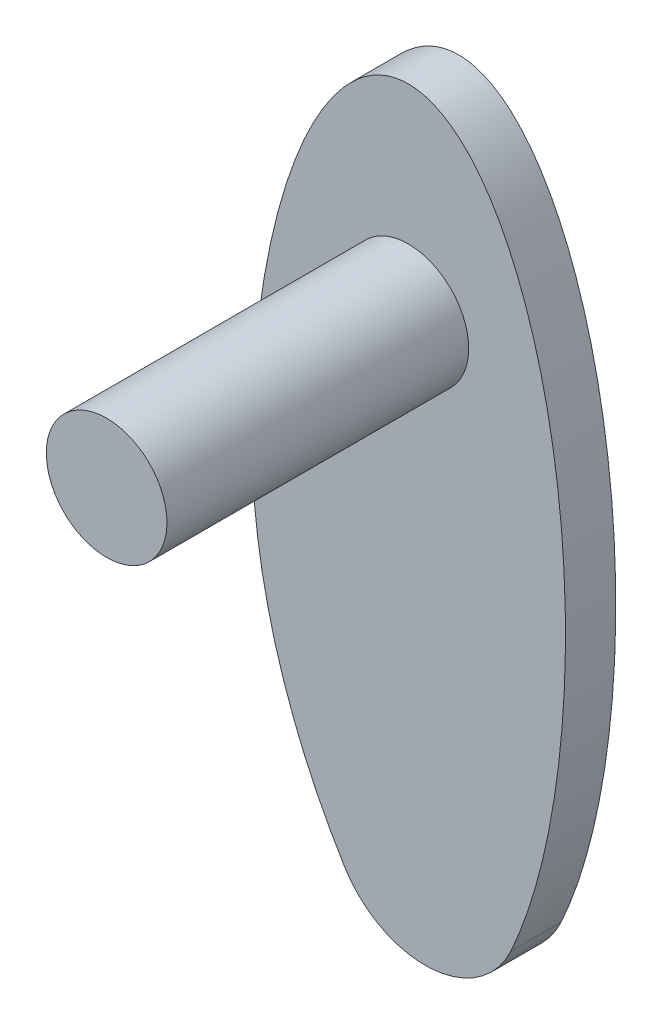
ISO-10303-21;
HEADER;
FILE_DESCRIPTION(('STEP AP214'),'2;1');
FILE_NAME('part.step','',(''),(''),'','','');
FILE_SCHEMA(('AUTOMOTIVE_DESIGN { 1 0 10303 214 1 1 1 1 }'));
ENDSEC;
DATA;
#1=APPLICATION_CONTEXT('core data for automotive mechanical design processes');
#2=APPLICATION_PROTOCOL_DEFINITION('international standard','automotive_design',2000,#1);
#3=PRODUCT_CONTEXT('',#1,'mechanical');
#4=PRODUCT('Part','Part','',(#3));
#5=PRODUCT_RELATED_PRODUCT_CATEGORY('part','',(#4));
#6=PRODUCT_DEFINITION_FORMATION('','',#4);
#7=PRODUCT_DEFINITION_CONTEXT('part definition',#1,'design');
#8=PRODUCT_DEFINITION('design','',#6,#7);
#9=PRODUCT_DEFINITION_SHAPE('','',#8);
#10=(LENGTH_UNIT() NAMED_UNIT(*) SI_UNIT(.MILLI.,.METRE.));
#11=(NAMED_UNIT(*) PLANE_ANGLE_UNIT() SI_UNIT($,.RADIAN.));
#12=(NAMED_UNIT(*) SI_UNIT($,.STERADIAN.) SOLID_ANGLE_UNIT());
#13=UNCERTAINTY_MEASURE_WITH_UNIT(LENGTH_MEASURE(1.E-05),#10,'distance_accuracy_value','');
#14=(GEOMETRIC_REPRESENTATION_CONTEXT(3) GLOBAL_UNCERTAINTY_ASSIGNED_CONTEXT((#13)) GLOBAL_UNIT_ASSIGNED_CONTEXT((#10,
#11,#12)) REPRESENTATION_CONTEXT('',''));
#15=CARTESIAN_POINT('',(0.,0.,0.));
#16=DIRECTION('',(0.,0.,1.));
#17=DIRECTION('',(1.,0.,0.));
#18=AXIS2_PLACEMENT_3D('',#15,#16,#17);
#19=CARTESIAN_POINT('',(-2.55588075372051,-17.4212312040918,2.));
#20=CARTESIAN_POINT('',(9.94411924627949,-17.4212312040918,2.));
#21=CARTESIAN_POINT('',(9.94411924627949,14.2454354625749,2.));
#22=CARTESIAN_POINT('',(-2.55588075372051,14.2454354625749,2.));
#23=CARTESIAN_POINT('',(-15.0558807537205,14.2454354625749,2.));
#24=CARTESIAN_POINT('',(-15.0558807537205,-17.4212312040918,2.));
#25=CARTESIAN_POINT('',(-2.55588075372051,-17.4212312040918,2.));
#26=(BOUNDED_CURVE() B_SPLINE_CURVE(3,(#19,#20,#21,#22,#23,#24,#25),.UNSPECIFIED.,.T.,
.F.) B_SPLINE_CURVE_WITH_KNOTS((4,3,4),(0.,0.5,1.),
.UNSPECIFIED.) CURVE() GEOMETRIC_REPRESENTATION_ITEM() RATIONAL_B_SPLINE_CURVE((1.,
0.333333333333333,0.333333333333333,1.,0.333333333333333,0.333333333333333,1.)) REPRESENTATION_ITEM(''));
#27=DIRECTION('',(0.,0.,-1.));
#28=VECTOR('',#27,1.);
#29=SURFACE_OF_LINEAR_EXTRUSION('',#26,#28);
#30=CARTESIAN_POINT('',(1.5156159873441,-13.6006574199439,2.));
#31=CARTESIAN_POINT('',(5.19639643160717,-5.59428302332968,2.));
#32=CARTESIAN_POINT('',(4.66204025063316,6.62121953506946,2.));
#33=CARTESIAN_POINT('',(0.378602795937045,12.3917200299613,2.));
#34=CARTESIAN_POINT('',(-3.90483465875907,18.1622205248531,2.));
#35=CARTESIAN_POINT('',(-8.20142027791291,12.4547975971881,2.));
#36=CARTESIAN_POINT('',(-8.76375337197133,0.24735754525041,2.));
#37=(BOUNDED_CURVE() B_SPLINE_CURVE(3,(#30,#31,#32,#33,#34,#35,#36),.UNSPECIFIED.,.F.,
.F.) B_SPLINE_CURVE_WITH_KNOTS((4,3,4),(0.,0.5,1.),
.UNSPECIFIED.) CURVE() GEOMETRIC_REPRESENTATION_ITEM() RATIONAL_B_SPLINE_CURVE((1.,
0.709272973028667,0.709272973028667,1.,0.709272973028667,0.709272973028667,1.)) REPRESENTATION_ITEM(''));
#38=CARTESIAN_POINT('',(1.5156159873441,-13.6006574199439,2.));
#39=VERTEX_POINT('',#38);
#40=CARTESIAN_POINT('',(-8.76375337199327,0.247357545256898,2.));
#41=VERTEX_POINT('',#40);
#42=EDGE_CURVE('E73',#39,#41,#37,.T.);
#43=ORIENTED_EDGE('',*,*,#42,.F.);
#44=DIRECTION('',(0.,0.,-1.));
#45=VECTOR('',#44,1.);
#46=CARTESIAN_POINT('',(1.5156159897436,-13.600657421047,2.));
#47=LINE('',#46,#45);
#48=CARTESIAN_POINT('',(1.5156159897436,-13.600657421047,0.));
#49=VERTEX_POINT('',#48);
#50=EDGE_CURVE('E81',#39,#49,#47,.T.);
#51=ORIENTED_EDGE('',*,*,#50,.T.);
#52=CARTESIAN_POINT('',(1.5156159897436,-13.600657421047,0.));
#53=CARTESIAN_POINT('',(5.19639643209695,-5.59428301617578,0.));
#54=CARTESIAN_POINT('',(4.66204024900677,6.62121954701542,0.));
#55=CARTESIAN_POINT('',(0.378602793782711,12.3917200402212,0.));
#56=CARTESIAN_POINT('',(-3.90483466144135,18.162220533427,0.));
#57=CARTESIAN_POINT('',(-8.20142027948347,12.4547975996194,0.));
#58=CARTESIAN_POINT('',(-8.76375337217039,0.247357541895043,0.));
#59=(BOUNDED_CURVE() B_SPLINE_CURVE(3,(#52,#53,#54,#55,#56,#57,#58),.UNSPECIFIED.,.F.,
.F.) B_SPLINE_CURVE_WITH_KNOTS((4,3,4),(0.,0.5,1.),
.UNSPECIFIED.) CURVE() GEOMETRIC_REPRESENTATION_ITEM() RATIONAL_B_SPLINE_CURVE((1.,
0.709272973060496,0.709272973060496,1.,0.709272973060495,0.709272973060495,1.)) REPRESENTATION_ITEM(''));
#60=CARTESIAN_POINT('',(-8.76375337217039,0.247357541895043,0.));
#61=VERTEX_POINT('',#60);
#62=EDGE_CURVE('E87',#49,#61,#59,.T.);
#63=ORIENTED_EDGE('',*,*,#62,.T.);
#64=DIRECTION('',(0.,0.,-1.));
#65=VECTOR('',#64,1.);
#66=CARTESIAN_POINT('',(-8.76375337217039,0.247357541895039,0.));
#67=LINE('',#66,#65);
#68=EDGE_CURVE('E106',#61,#41,#67,.F.);
#69=ORIENTED_EDGE('',*,*,#68,.T.);
#70=EDGE_LOOP('',(#43,#51,#63,#69));
#71=FACE_BOUND('',#70,.T.);
#72=ADVANCED_FACE('F39',(#71),#29,.F.);
#73=CARTESIAN_POINT('',(-2.55588075372051,-1.58789787075845,2.));
#74=DIRECTION('',(0.,0.,-1.));
#75=DIRECTION('',(-1.,0.,0.));
#76=AXIS2_PLACEMENT_3D('',#73,#74,#75);
#77=PLANE('',#76);
#78=CARTESIAN_POINT('',(-2.55588075372051,6.32876879590805,2.));
#79=DIRECTION('',(0.,0.,-1.));
#80=DIRECTION('',(-1.,0.,0.));
#81=AXIS2_PLACEMENT_3D('',#78,#79,#80);
#82=CIRCLE('',#81,2.4);
#83=CARTESIAN_POINT('',(-4.95588075372051,6.32876879590805,2.));
#84=VERTEX_POINT('',#83);
#85=EDGE_CURVE('E95',#84,#84,#82,.T.);
#86=ORIENTED_EDGE('',*,*,#85,.T.);
#87=EDGE_LOOP('',(#86));
#88=FACE_BOUND('',#87,.T.);
#89=CARTESIAN_POINT('',(16.2097642120742,-0.903042157961228,2.));
#90=DIRECTION('',(0.,0.,1.));
#91=DIRECTION('',(1.,0.,0.));
#92=AXIS2_PLACEMENT_3D('',#89,#90,#91);
#93=CIRCLE('',#92,25.);
#94=CARTESIAN_POINT('',(-5.08592402095397,-13.9986010494965,2.));
#95=VERTEX_POINT('',#94);
#96=EDGE_CURVE('E90',#41,#95,#93,.T.);
#97=ORIENTED_EDGE('',*,*,#96,.T.);
#98=CARTESIAN_POINT('',(-1.89157078599975,-12.0342672157662,2.));
#99=DIRECTION('',(0.,0.,1.));
#100=DIRECTION('',(0.,-1.,0.));
#101=AXIS2_PLACEMENT_3D('',#98,#99,#100);
#102=CIRCLE('',#101,3.75);
#103=EDGE_CURVE('E11',#95,#39,#102,.T.);
#104=ORIENTED_EDGE('',*,*,#103,.T.);
#105=ORIENTED_EDGE('',*,*,#42,.T.);
#106=EDGE_LOOP('',(#97,#104,#105));
#107=FACE_BOUND('',#106,.T.);
#108=ADVANCED_FACE('F135',(#88,#107),#77,.F.);
#109=CARTESIAN_POINT('',(-2.55588075372051,-1.58789787075845,0.));
#110=DIRECTION('',(0.,0.,-1.));
#111=DIRECTION('',(-1.,0.,0.));
#112=AXIS2_PLACEMENT_3D('',#109,#110,#111);
#113=PLANE('',#112);
#114=ORIENTED_EDGE('',*,*,#62,.F.);
#115=CARTESIAN_POINT('',(-1.89157078599975,-12.0342672157662,0.));
#116=DIRECTION('',(0.,0.,-1.));
#117=DIRECTION('',(-1.,0.,0.));
#118=AXIS2_PLACEMENT_3D('',#115,#116,#117);
#119=CIRCLE('',#118,3.75);
#120=CARTESIAN_POINT('',(-5.08592402095397,-13.9986010494965,0.));
#121=VERTEX_POINT('',#120);
#122=EDGE_CURVE('E78',#49,#121,#119,.T.);
#123=ORIENTED_EDGE('',*,*,#122,.T.);
#124=CARTESIAN_POINT('',(16.2097642120742,-0.903042157961217,0.));
#125=DIRECTION('',(0.,0.,-1.));
#126=DIRECTION('',(-1.,0.,0.));
#127=AXIS2_PLACEMENT_3D('',#124,#125,#126);
#128=CIRCLE('',#127,25.);
#129=EDGE_CURVE('E93',#121,#61,#128,.T.);
#130=ORIENTED_EDGE('',*,*,#129,.T.);
#131=EDGE_LOOP('',(#114,#123,#130));
#132=FACE_BOUND('',#131,.T.);
#133=ADVANCED_FACE('F92',(#132),#113,.T.);
#134=CARTESIAN_POINT('',(-2.55588075372051,6.32876879590805,14.));
#135=DIRECTION('',(0.,0.,-1.));
#136=DIRECTION('',(0.,1.,0.));
#137=AXIS2_PLACEMENT_3D('',#134,#135,#136);
#138=CYLINDRICAL_SURFACE('',#137,2.4);
#139=CARTESIAN_POINT('',(-2.55588075372051,6.32876879590805,14.));
#140=DIRECTION('',(0.,0.,-1.));
#141=DIRECTION('',(0.,1.,0.));
#142=AXIS2_PLACEMENT_3D('',#139,#140,#141);
#143=CIRCLE('',#142,2.4);
#144=CARTESIAN_POINT('',(-2.55588075372051,8.72876879590805,14.));
#145=VERTEX_POINT('',#144);
#146=EDGE_CURVE('E101',#145,#145,#143,.T.);
#147=ORIENTED_EDGE('',*,*,#146,.T.);
#148=EDGE_LOOP('',(#147));
#149=FACE_BOUND('',#148,.T.);
#150=ORIENTED_EDGE('',*,*,#85,.F.);
#151=EDGE_LOOP('',(#150));
#152=FACE_BOUND('',#151,.T.);
#153=ADVANCED_FACE('F122',(#149,#152),#138,.T.);
#154=CARTESIAN_POINT('',(-2.55588075372051,6.32876879590805,14.));
#155=DIRECTION('',(0.,0.,-1.));
#156=DIRECTION('',(-1.,0.,0.));
#157=AXIS2_PLACEMENT_3D('',#154,#155,#156);
#158=PLANE('',#157);
#159=ORIENTED_EDGE('',*,*,#146,.F.);
#160=EDGE_LOOP('',(#159));
#161=FACE_BOUND('',#160,.T.);
#162=ADVANCED_FACE('F125',(#161),#158,.F.);
#163=CARTESIAN_POINT('',(16.2097642120741,-0.903042157961217,1.));
#164=DIRECTION('',(0.,0.,-1.));
#165=DIRECTION('',(-1.,0.,0.));
#166=AXIS2_PLACEMENT_3D('',#163,#164,#165);
#167=CYLINDRICAL_SURFACE('',#166,25.);
#168=ORIENTED_EDGE('',*,*,#129,.F.);
#169=DIRECTION('',(0.,0.,-1.));
#170=VECTOR('',#169,1.);
#171=CARTESIAN_POINT('',(-5.08592402095397,-13.9986010494965,1.));
#172=LINE('',#171,#170);
#173=EDGE_CURVE('E52',#121,#95,#172,.F.);
#174=ORIENTED_EDGE('',*,*,#173,.T.);
#175=ORIENTED_EDGE('',*,*,#96,.F.);
#176=ORIENTED_EDGE('',*,*,#68,.F.);
#177=EDGE_LOOP('',(#168,#174,#175,#176));
#178=FACE_BOUND('',#177,.T.);
#179=ADVANCED_FACE('F127',(#178),#167,.T.);
#180=CARTESIAN_POINT('',(-1.89157078599975,-12.0342672157662,1.));
#181=DIRECTION('',(0.,0.,-1.));
#182=DIRECTION('',(-1.,0.,0.));
#183=AXIS2_PLACEMENT_3D('',#180,#181,#182);
#184=CYLINDRICAL_SURFACE('',#183,3.75);
#185=ORIENTED_EDGE('',*,*,#103,.F.);
#186=ORIENTED_EDGE('',*,*,#173,.F.);
#187=ORIENTED_EDGE('',*,*,#122,.F.);
#188=ORIENTED_EDGE('',*,*,#50,.F.);
#189=EDGE_LOOP('',(#185,#186,#187,#188));
#190=FACE_BOUND('',#189,.T.);
#191=ADVANCED_FACE('F41',(#190),#184,.T.);
#192=CLOSED_SHELL('',(#72,#108,#133,#153,#162,#179,#191));
#193=MANIFOLD_SOLID_BREP('B2',#192);
#194=ADVANCED_BREP_SHAPE_REPRESENTATION('',(#18,#193),#14);
#195=SHAPE_DEFINITION_REPRESENTATION(#9,#194);
ENDSEC;
END-ISO-10303-21;
